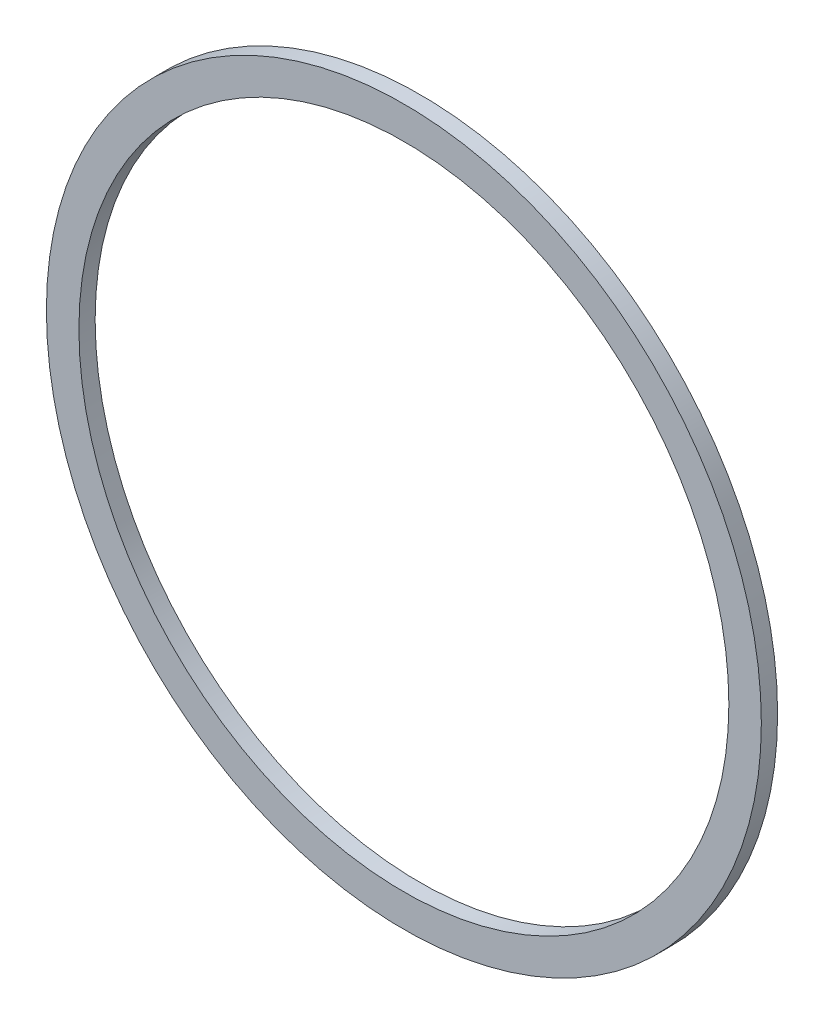
ISO-10303-21;
HEADER;
FILE_DESCRIPTION(('STEP AP214'),'2;1');
FILE_NAME('part.step','',(''),(''),'','','');
FILE_SCHEMA(('AUTOMOTIVE_DESIGN { 1 0 10303 214 1 1 1 1 }'));
ENDSEC;
DATA;
#1=APPLICATION_CONTEXT('core data for automotive mechanical design processes');
#2=APPLICATION_PROTOCOL_DEFINITION('international standard','automotive_design',2000,#1);
#3=PRODUCT_CONTEXT('',#1,'mechanical');
#4=PRODUCT('Part','Part','',(#3));
#5=PRODUCT_RELATED_PRODUCT_CATEGORY('part','',(#4));
#6=PRODUCT_DEFINITION_FORMATION('','',#4);
#7=PRODUCT_DEFINITION_CONTEXT('part definition',#1,'design');
#8=PRODUCT_DEFINITION('design','',#6,#7);
#9=PRODUCT_DEFINITION_SHAPE('','',#8);
#10=(LENGTH_UNIT() NAMED_UNIT(*) SI_UNIT(.MILLI.,.METRE.));
#11=(NAMED_UNIT(*) PLANE_ANGLE_UNIT() SI_UNIT($,.RADIAN.));
#12=(NAMED_UNIT(*) SI_UNIT($,.STERADIAN.) SOLID_ANGLE_UNIT());
#13=UNCERTAINTY_MEASURE_WITH_UNIT(LENGTH_MEASURE(1.E-05),#10,'distance_accuracy_value','');
#14=(GEOMETRIC_REPRESENTATION_CONTEXT(3) GLOBAL_UNCERTAINTY_ASSIGNED_CONTEXT((#13)) GLOBAL_UNIT_ASSIGNED_CONTEXT((#10,
#11,#12)) REPRESENTATION_CONTEXT('',''));
#15=CARTESIAN_POINT('',(0.,0.,0.));
#16=DIRECTION('',(0.,0.,1.));
#17=DIRECTION('',(1.,0.,0.));
#18=AXIS2_PLACEMENT_3D('',#15,#16,#17);
#19=CARTESIAN_POINT('',(0.,0.,-25.4));
#20=DIRECTION('',(0.,0.,1.));
#21=DIRECTION('',(1.,0.,0.));
#22=AXIS2_PLACEMENT_3D('',#19,#20,#21);
#23=CYLINDRICAL_SURFACE('',#22,558.8);
#24=CARTESIAN_POINT('',(0.,0.,-25.4));
#25=DIRECTION('',(0.,0.,1.));
#26=DIRECTION('',(1.,0.,0.));
#27=AXIS2_PLACEMENT_3D('',#24,#25,#26);
#28=CIRCLE('',#27,558.8);
#29=CARTESIAN_POINT('',(558.8,0.,-25.4));
#30=VERTEX_POINT('',#29);
#31=EDGE_CURVE('E10',#30,#30,#28,.T.);
#32=ORIENTED_EDGE('',*,*,#31,.T.);
#33=EDGE_LOOP('',(#32));
#34=FACE_BOUND('',#33,.T.);
#35=CARTESIAN_POINT('',(0.,0.,0.));
#36=DIRECTION('',(0.,0.,1.));
#37=DIRECTION('',(1.,0.,0.));
#38=AXIS2_PLACEMENT_3D('',#35,#36,#37);
#39=CIRCLE('',#38,558.8);
#40=CARTESIAN_POINT('',(558.8,0.,0.));
#41=VERTEX_POINT('',#40);
#42=EDGE_CURVE('E40',#41,#41,#39,.T.);
#43=ORIENTED_EDGE('',*,*,#42,.F.);
#44=EDGE_LOOP('',(#43));
#45=FACE_BOUND('',#44,.T.);
#46=ADVANCED_FACE('F37',(#34,#45),#23,.T.);
#47=CARTESIAN_POINT('',(0.,0.,-25.4));
#48=DIRECTION('',(0.,0.,1.));
#49=DIRECTION('',(1.,0.,0.));
#50=AXIS2_PLACEMENT_3D('',#47,#48,#49);
#51=PLANE('',#50);
#52=CARTESIAN_POINT('',(0.,0.,-25.4));
#53=DIRECTION('',(0.,0.,1.));
#54=DIRECTION('',(1.,0.,0.));
#55=AXIS2_PLACEMENT_3D('',#52,#53,#54);
#56=CIRCLE('',#55,508.);
#57=CARTESIAN_POINT('',(508.,0.,-25.4));
#58=VERTEX_POINT('',#57);
#59=EDGE_CURVE('E47',#58,#58,#56,.T.);
#60=ORIENTED_EDGE('',*,*,#59,.T.);
#61=EDGE_LOOP('',(#60));
#62=FACE_BOUND('',#61,.T.);
#63=ORIENTED_EDGE('',*,*,#31,.F.);
#64=EDGE_LOOP('',(#63));
#65=FACE_BOUND('',#64,.T.);
#66=ADVANCED_FACE('F55',(#62,#65),#51,.F.);
#67=CARTESIAN_POINT('',(0.,0.,0.));
#68=DIRECTION('',(0.,0.,1.));
#69=DIRECTION('',(1.,0.,0.));
#70=AXIS2_PLACEMENT_3D('',#67,#68,#69);
#71=PLANE('',#70);
#72=CARTESIAN_POINT('',(0.,0.,0.));
#73=DIRECTION('',(0.,0.,1.));
#74=DIRECTION('',(1.,0.,0.));
#75=AXIS2_PLACEMENT_3D('',#72,#73,#74);
#76=CIRCLE('',#75,508.);
#77=CARTESIAN_POINT('',(508.,0.,0.));
#78=VERTEX_POINT('',#77);
#79=EDGE_CURVE('E49',#78,#78,#76,.T.);
#80=ORIENTED_EDGE('',*,*,#79,.F.);
#81=EDGE_LOOP('',(#80));
#82=FACE_BOUND('',#81,.T.);
#83=ORIENTED_EDGE('',*,*,#42,.T.);
#84=EDGE_LOOP('',(#83));
#85=FACE_BOUND('',#84,.T.);
#86=ADVANCED_FACE('F61',(#82,#85),#71,.T.);
#87=CARTESIAN_POINT('',(0.,0.,-25.4));
#88=DIRECTION('',(0.,0.,1.));
#89=DIRECTION('',(1.,0.,0.));
#90=AXIS2_PLACEMENT_3D('',#87,#88,#89);
#91=CYLINDRICAL_SURFACE('',#90,508.);
#92=ORIENTED_EDGE('',*,*,#59,.F.);
#93=EDGE_LOOP('',(#92));
#94=FACE_BOUND('',#93,.T.);
#95=ORIENTED_EDGE('',*,*,#79,.T.);
#96=EDGE_LOOP('',(#95));
#97=FACE_BOUND('',#96,.T.);
#98=ADVANCED_FACE('F58',(#94,#97),#91,.F.);
#99=CLOSED_SHELL('',(#46,#66,#86,#98));
#100=MANIFOLD_SOLID_BREP('B2',#99);
#101=ADVANCED_BREP_SHAPE_REPRESENTATION('',(#18,#100),#14);
#102=SHAPE_DEFINITION_REPRESENTATION(#9,#101);
ENDSEC;
END-ISO-10303-21;
